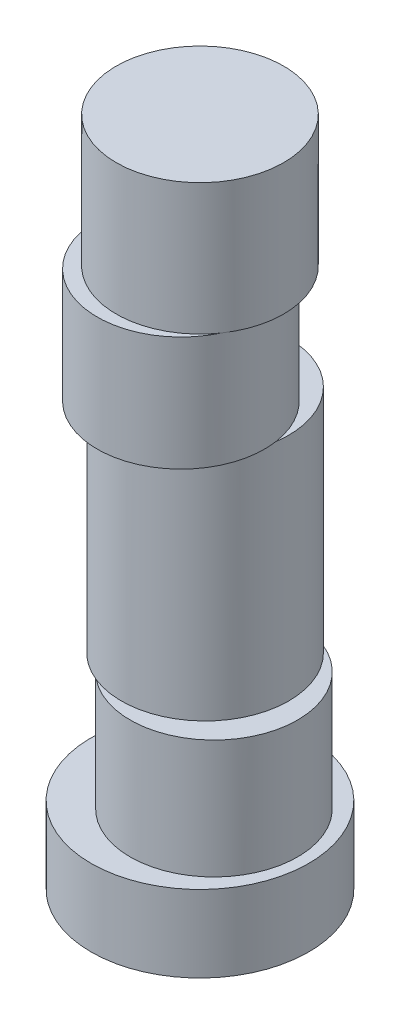
ISO-10303-21;
HEADER;
FILE_DESCRIPTION(('STEP AP214'),'2;1');
FILE_NAME('part.step','',(''),(''),'','','');
FILE_SCHEMA(('AUTOMOTIVE_DESIGN { 1 0 10303 214 1 1 1 1 }'));
ENDSEC;
DATA;
#1=APPLICATION_CONTEXT('core data for automotive mechanical design processes');
#2=APPLICATION_PROTOCOL_DEFINITION('international standard','automotive_design',2000,#1);
#3=PRODUCT_CONTEXT('',#1,'mechanical');
#4=PRODUCT('Part','Part','',(#3));
#5=PRODUCT_RELATED_PRODUCT_CATEGORY('part','',(#4));
#6=PRODUCT_DEFINITION_FORMATION('','',#4);
#7=PRODUCT_DEFINITION_CONTEXT('part definition',#1,'design');
#8=PRODUCT_DEFINITION('design','',#6,#7);
#9=PRODUCT_DEFINITION_SHAPE('','',#8);
#10=(LENGTH_UNIT() NAMED_UNIT(*) SI_UNIT(.MILLI.,.METRE.));
#11=(NAMED_UNIT(*) PLANE_ANGLE_UNIT() SI_UNIT($,.RADIAN.));
#12=(NAMED_UNIT(*) SI_UNIT($,.STERADIAN.) SOLID_ANGLE_UNIT());
#13=UNCERTAINTY_MEASURE_WITH_UNIT(LENGTH_MEASURE(1.E-05),#10,'distance_accuracy_value','');
#14=(GEOMETRIC_REPRESENTATION_CONTEXT(3) GLOBAL_UNCERTAINTY_ASSIGNED_CONTEXT((#13)) GLOBAL_UNIT_ASSIGNED_CONTEXT((#10,
#11,#12)) REPRESENTATION_CONTEXT('',''));
#15=CARTESIAN_POINT('',(0.,0.,0.));
#16=DIRECTION('',(0.,0.,1.));
#17=DIRECTION('',(1.,0.,0.));
#18=AXIS2_PLACEMENT_3D('',#15,#16,#17);
#19=CARTESIAN_POINT('',(0.,5.5,0.));
#20=DIRECTION('',(0.,-1.,0.));
#21=DIRECTION('',(0.,0.,-1.));
#22=AXIS2_PLACEMENT_3D('',#19,#20,#21);
#23=CYLINDRICAL_SURFACE('',#22,7.8);
#24=CARTESIAN_POINT('',(0.,5.5,0.));
#25=DIRECTION('',(0.,1.,0.));
#26=DIRECTION('',(0.,0.,1.));
#27=AXIS2_PLACEMENT_3D('',#24,#25,#26);
#28=CIRCLE('',#27,7.8);
#29=CARTESIAN_POINT('',(0.,5.5,7.8));
#30=VERTEX_POINT('',#29);
#31=EDGE_CURVE('E124',#30,#30,#28,.T.);
#32=ORIENTED_EDGE('',*,*,#31,.F.);
#33=EDGE_LOOP('',(#32));
#34=FACE_BOUND('',#33,.T.);
#35=CARTESIAN_POINT('',(0.,0.,0.));
#36=DIRECTION('',(0.,1.,0.));
#37=DIRECTION('',(0.,0.,1.));
#38=AXIS2_PLACEMENT_3D('',#35,#36,#37);
#39=CIRCLE('',#38,7.8);
#40=CARTESIAN_POINT('',(0.,0.,7.8));
#41=VERTEX_POINT('',#40);
#42=EDGE_CURVE('E44',#41,#41,#39,.T.);
#43=ORIENTED_EDGE('',*,*,#42,.T.);
#44=EDGE_LOOP('',(#43));
#45=FACE_BOUND('',#44,.T.);
#46=ADVANCED_FACE('F41',(#34,#45),#23,.T.);
#47=CARTESIAN_POINT('',(0.,5.5,0.));
#48=DIRECTION('',(0.,1.,0.));
#49=DIRECTION('',(0.,0.,1.));
#50=AXIS2_PLACEMENT_3D('',#47,#48,#49);
#51=PLANE('',#50);
#52=CARTESIAN_POINT('',(1.,5.5,0.));
#53=DIRECTION('',(0.,1.,0.));
#54=DIRECTION('',(0.,0.,1.));
#55=AXIS2_PLACEMENT_3D('',#52,#53,#54);
#56=CIRCLE('',#55,6.);
#57=CARTESIAN_POINT('',(1.,5.5,6.));
#58=VERTEX_POINT('',#57);
#59=EDGE_CURVE('E121',#58,#58,#56,.T.);
#60=ORIENTED_EDGE('',*,*,#59,.F.);
#61=EDGE_LOOP('',(#60));
#62=FACE_BOUND('',#61,.T.);
#63=ORIENTED_EDGE('',*,*,#31,.T.);
#64=EDGE_LOOP('',(#63));
#65=FACE_BOUND('',#64,.T.);
#66=ADVANCED_FACE('F137',(#62,#65),#51,.T.);
#67=CARTESIAN_POINT('',(0.,0.,0.));
#68=DIRECTION('',(0.,1.,0.));
#69=DIRECTION('',(0.,0.,1.));
#70=AXIS2_PLACEMENT_3D('',#67,#68,#69);
#71=PLANE('',#70);
#72=CARTESIAN_POINT('',(0.,0.,0.));
#73=DIRECTION('',(0.,-1.,0.));
#74=DIRECTION('',(0.,0.,-1.));
#75=AXIS2_PLACEMENT_3D('',#72,#73,#74);
#76=CIRCLE('',#75,4.);
#77=CARTESIAN_POINT('',(0.,0.,-4.));
#78=VERTEX_POINT('',#77);
#79=EDGE_CURVE('E96',#78,#78,#76,.T.);
#80=ORIENTED_EDGE('',*,*,#79,.F.);
#81=EDGE_LOOP('',(#80));
#82=FACE_BOUND('',#81,.T.);
#83=ORIENTED_EDGE('',*,*,#42,.F.);
#84=EDGE_LOOP('',(#83));
#85=FACE_BOUND('',#84,.T.);
#86=ADVANCED_FACE('F134',(#82,#85),#71,.F.);
#87=CARTESIAN_POINT('',(1.,14.,0.));
#88=DIRECTION('',(0.,-1.,0.));
#89=DIRECTION('',(0.,0.,-1.));
#90=AXIS2_PLACEMENT_3D('',#87,#88,#89);
#91=CYLINDRICAL_SURFACE('',#90,6.);
#92=CARTESIAN_POINT('',(1.,14.,0.));
#93=DIRECTION('',(0.,1.,0.));
#94=DIRECTION('',(0.,0.,1.));
#95=AXIS2_PLACEMENT_3D('',#92,#93,#94);
#96=CIRCLE('',#95,6.);
#97=CARTESIAN_POINT('',(3.21858552175947,14.,-5.57475365219301));
#98=VERTEX_POINT('',#97);
#99=CARTESIAN_POINT('',(-2.71858552175947,14.,4.70872824840857));
#100=VERTEX_POINT('',#99);
#101=EDGE_CURVE('E117',#98,#100,#96,.T.);
#102=ORIENTED_EDGE('',*,*,#101,.F.);
#103=EDGE_CURVE('E112',#100,#98,#96,.T.);
#104=ORIENTED_EDGE('',*,*,#103,.F.);
#105=EDGE_LOOP('',(#102,#104));
#106=FACE_BOUND('',#105,.T.);
#107=ORIENTED_EDGE('',*,*,#59,.T.);
#108=EDGE_LOOP('',(#107));
#109=FACE_BOUND('',#108,.T.);
#110=ADVANCED_FACE('F136',(#106,#109),#91,.T.);
#111=CARTESIAN_POINT('',(1.,14.,0.));
#112=DIRECTION('',(0.,1.,0.));
#113=DIRECTION('',(0.,0.,1.));
#114=AXIS2_PLACEMENT_3D('',#111,#112,#113);
#115=PLANE('',#114);
#116=CARTESIAN_POINT('',(-0.500000000000004,14.,-0.866025403784436));
#117=DIRECTION('',(0.,1.,0.));
#118=DIRECTION('',(0.,0.,1.));
#119=AXIS2_PLACEMENT_3D('',#116,#117,#118);
#120=CIRCLE('',#119,6.);
#121=EDGE_CURVE('E50',#100,#98,#120,.T.);
#122=ORIENTED_EDGE('',*,*,#121,.F.);
#123=ORIENTED_EDGE('',*,*,#103,.T.);
#124=EDGE_LOOP('',(#122,#123));
#125=FACE_BOUND('',#124,.T.);
#126=ADVANCED_FACE('F143',(#125),#115,.T.);
#127=CARTESIAN_POINT('',(-0.500000000000004,14.,-0.866025403784436));
#128=DIRECTION('',(0.,1.,0.));
#129=DIRECTION('',(0.,0.,1.));
#130=AXIS2_PLACEMENT_3D('',#127,#128,#129);
#131=PLANE('',#130);
#132=EDGE_CURVE('E85',#98,#100,#120,.T.);
#133=ORIENTED_EDGE('',*,*,#132,.F.);
#134=ORIENTED_EDGE('',*,*,#101,.T.);
#135=EDGE_LOOP('',(#133,#134));
#136=FACE_BOUND('',#135,.T.);
#137=ADVANCED_FACE('F173',(#136),#131,.F.);
#138=CARTESIAN_POINT('',(-0.500000000000004,30.5,-0.866025403784436));
#139=DIRECTION('',(0.,-1.,0.));
#140=DIRECTION('',(0.,0.,-1.));
#141=AXIS2_PLACEMENT_3D('',#138,#139,#140);
#142=CYLINDRICAL_SURFACE('',#141,6.);
#143=CARTESIAN_POINT('',(-0.500000000000004,30.5,-0.866025403784436));
#144=DIRECTION('',(0.,1.,0.));
#145=DIRECTION('',(0.,0.,1.));
#146=AXIS2_PLACEMENT_3D('',#143,#144,#145);
#147=CIRCLE('',#146,6.);
#148=CARTESIAN_POINT('',(5.43717104351896,30.5,0.));
#149=VERTEX_POINT('',#148);
#150=CARTESIAN_POINT('',(-6.43717104351896,30.5,0.));
#151=VERTEX_POINT('',#150);
#152=EDGE_CURVE('E109',#149,#151,#147,.T.);
#153=ORIENTED_EDGE('',*,*,#152,.F.);
#154=EDGE_CURVE('E113',#151,#149,#147,.T.);
#155=ORIENTED_EDGE('',*,*,#154,.F.);
#156=EDGE_LOOP('',(#153,#155));
#157=FACE_BOUND('',#156,.T.);
#158=ORIENTED_EDGE('',*,*,#132,.T.);
#159=ORIENTED_EDGE('',*,*,#121,.T.);
#160=EDGE_LOOP('',(#158,#159));
#161=FACE_BOUND('',#160,.T.);
#162=ADVANCED_FACE('F183',(#157,#161),#142,.T.);
#163=CARTESIAN_POINT('',(-0.500000000000004,30.5,-0.866025403784436));
#164=DIRECTION('',(0.,1.,0.));
#165=DIRECTION('',(0.,0.,1.));
#166=AXIS2_PLACEMENT_3D('',#163,#164,#165);
#167=PLANE('',#166);
#168=CARTESIAN_POINT('',(-0.499999999999995,30.5,0.866025403784441));
#169=DIRECTION('',(0.,1.,0.));
#170=DIRECTION('',(0.,0.,1.));
#171=AXIS2_PLACEMENT_3D('',#168,#169,#170);
#172=CIRCLE('',#171,6.);
#173=EDGE_CURVE('E63',#149,#151,#172,.T.);
#174=ORIENTED_EDGE('',*,*,#173,.F.);
#175=ORIENTED_EDGE('',*,*,#152,.T.);
#176=EDGE_LOOP('',(#174,#175));
#177=FACE_BOUND('',#176,.T.);
#178=ADVANCED_FACE('F193',(#177),#167,.T.);
#179=CARTESIAN_POINT('',(-0.499999999999995,30.5,0.866025403784441));
#180=DIRECTION('',(0.,1.,0.));
#181=DIRECTION('',(0.,0.,1.));
#182=AXIS2_PLACEMENT_3D('',#179,#180,#181);
#183=PLANE('',#182);
#184=EDGE_CURVE('E103',#151,#149,#172,.T.);
#185=ORIENTED_EDGE('',*,*,#184,.F.);
#186=ORIENTED_EDGE('',*,*,#154,.T.);
#187=EDGE_LOOP('',(#185,#186));
#188=FACE_BOUND('',#187,.T.);
#189=ADVANCED_FACE('F203',(#188),#183,.F.);
#190=CARTESIAN_POINT('',(-0.499999999999995,38.7,0.866025403784441));
#191=DIRECTION('',(0.,-1.,0.));
#192=DIRECTION('',(0.,0.,-1.));
#193=AXIS2_PLACEMENT_3D('',#190,#191,#192);
#194=CYLINDRICAL_SURFACE('',#193,6.);
#195=CARTESIAN_POINT('',(-0.499999999999995,38.7,0.866025403784441));
#196=DIRECTION('',(0.,1.,0.));
#197=DIRECTION('',(0.,0.,1.));
#198=AXIS2_PLACEMENT_3D('',#195,#196,#197);
#199=CIRCLE('',#198,6.);
#200=CARTESIAN_POINT('',(4.92807879430201,38.7,3.42257788766756));
#201=VERTEX_POINT('',#200);
#202=CARTESIAN_POINT('',(-5.42807879430201,38.7,-2.5565524838831));
#203=VERTEX_POINT('',#202);
#204=EDGE_CURVE('E77',#201,#203,#199,.T.);
#205=ORIENTED_EDGE('',*,*,#204,.F.);
#206=EDGE_CURVE('E80',#203,#201,#199,.T.);
#207=ORIENTED_EDGE('',*,*,#206,.F.);
#208=EDGE_LOOP('',(#205,#207));
#209=FACE_BOUND('',#208,.T.);
#210=ORIENTED_EDGE('',*,*,#173,.T.);
#211=ORIENTED_EDGE('',*,*,#184,.T.);
#212=EDGE_LOOP('',(#210,#211));
#213=FACE_BOUND('',#212,.T.);
#214=ADVANCED_FACE('F78',(#209,#213),#194,.T.);
#215=CARTESIAN_POINT('',(-0.499999999999995,38.7,0.866025403784441));
#216=DIRECTION('',(0.,1.,0.));
#217=DIRECTION('',(0.,0.,1.));
#218=AXIS2_PLACEMENT_3D('',#215,#216,#217);
#219=PLANE('',#218);
#220=CARTESIAN_POINT('',(0.,38.7,0.));
#221=DIRECTION('',(0.,1.,0.));
#222=DIRECTION('',(0.,0.,1.));
#223=AXIS2_PLACEMENT_3D('',#220,#221,#222);
#224=CIRCLE('',#223,6.);
#225=EDGE_CURVE('E11',#203,#201,#224,.T.);
#226=ORIENTED_EDGE('',*,*,#225,.F.);
#227=ORIENTED_EDGE('',*,*,#206,.T.);
#228=EDGE_LOOP('',(#226,#227));
#229=FACE_BOUND('',#228,.T.);
#230=ADVANCED_FACE('F87',(#229),#219,.T.);
#231=CARTESIAN_POINT('',(0.,38.7,0.));
#232=DIRECTION('',(0.,-1.,0.));
#233=DIRECTION('',(0.,0.,-1.));
#234=AXIS2_PLACEMENT_3D('',#231,#232,#233);
#235=CYLINDRICAL_SURFACE('',#234,4.);
#236=CARTESIAN_POINT('',(0.,38.7,0.));
#237=DIRECTION('',(0.,-1.,0.));
#238=DIRECTION('',(0.,0.,-1.));
#239=AXIS2_PLACEMENT_3D('',#236,#237,#238);
#240=CIRCLE('',#239,4.);
#241=CARTESIAN_POINT('',(0.,38.7,-4.));
#242=VERTEX_POINT('',#241);
#243=EDGE_CURVE('E99',#242,#242,#240,.T.);
#244=ORIENTED_EDGE('',*,*,#243,.F.);
#245=EDGE_LOOP('',(#244));
#246=FACE_BOUND('',#245,.T.);
#247=ORIENTED_EDGE('',*,*,#79,.T.);
#248=EDGE_LOOP('',(#247));
#249=FACE_BOUND('',#248,.T.);
#250=ADVANCED_FACE('F222',(#246,#249),#235,.F.);
#251=CARTESIAN_POINT('',(0.,48.1,0.));
#252=DIRECTION('',(0.,1.,0.));
#253=DIRECTION('',(0.,0.,1.));
#254=AXIS2_PLACEMENT_3D('',#251,#252,#253);
#255=PLANE('',#254);
#256=CARTESIAN_POINT('',(0.,48.1,0.));
#257=DIRECTION('',(0.,1.,0.));
#258=DIRECTION('',(0.,0.,1.));
#259=AXIS2_PLACEMENT_3D('',#256,#257,#258);
#260=CIRCLE('',#259,6.);
#261=CARTESIAN_POINT('',(0.,48.1,6.00000000000002));
#262=VERTEX_POINT('',#261);
#263=EDGE_CURVE('E93',#262,#262,#260,.T.);
#264=ORIENTED_EDGE('',*,*,#263,.T.);
#265=EDGE_LOOP('',(#264));
#266=FACE_BOUND('',#265,.T.);
#267=ADVANCED_FACE('F227',(#266),#255,.T.);
#268=CARTESIAN_POINT('',(0.,48.1,0.));
#269=DIRECTION('',(0.,-1.,0.));
#270=DIRECTION('',(0.,0.,-1.));
#271=AXIS2_PLACEMENT_3D('',#268,#269,#270);
#272=CYLINDRICAL_SURFACE('',#271,6.);
#273=ORIENTED_EDGE('',*,*,#263,.F.);
#274=EDGE_LOOP('',(#273));
#275=FACE_BOUND('',#274,.T.);
#276=EDGE_CURVE('E52',#201,#203,#224,.T.);
#277=ORIENTED_EDGE('',*,*,#276,.T.);
#278=ORIENTED_EDGE('',*,*,#225,.T.);
#279=EDGE_LOOP('',(#277,#278));
#280=FACE_BOUND('',#279,.T.);
#281=ADVANCED_FACE('F90',(#275,#280),#272,.T.);
#282=CARTESIAN_POINT('',(0.,38.7,0.));
#283=DIRECTION('',(0.,1.,0.));
#284=DIRECTION('',(0.,0.,1.));
#285=AXIS2_PLACEMENT_3D('',#282,#283,#284);
#286=PLANE('',#285);
#287=ORIENTED_EDGE('',*,*,#276,.F.);
#288=ORIENTED_EDGE('',*,*,#204,.T.);
#289=EDGE_LOOP('',(#287,#288));
#290=FACE_BOUND('',#289,.T.);
#291=ADVANCED_FACE('F91',(#290),#286,.F.);
#292=ORIENTED_EDGE('',*,*,#243,.T.);
#293=EDGE_LOOP('',(#292));
#294=FACE_BOUND('',#293,.T.);
#295=ADVANCED_FACE('F269',(#294),#286,.F.);
#296=CLOSED_SHELL('',(#46,#66,#86,#110,#126,#137,#162,#178,#189,#214,#230,#250,#267,#281,#291,#295));
#297=MANIFOLD_SOLID_BREP('B2',#296);
#298=ADVANCED_BREP_SHAPE_REPRESENTATION('',(#18,#297),#14);
#299=SHAPE_DEFINITION_REPRESENTATION(#9,#298);
ENDSEC;
END-ISO-10303-21;
